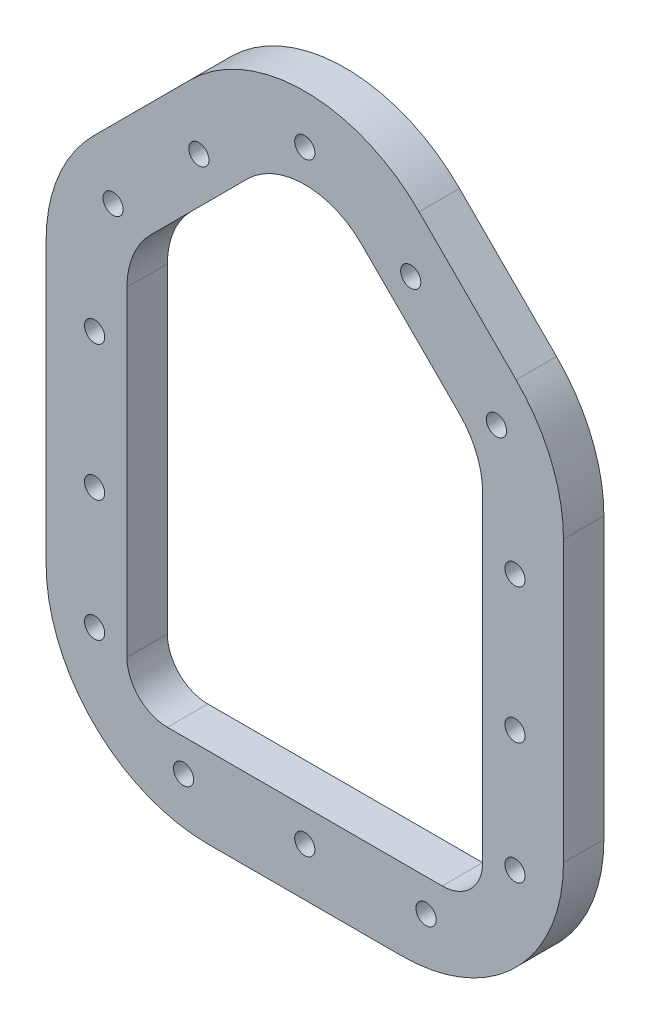
ISO-10303-21;
HEADER;
FILE_DESCRIPTION(('STEP AP214'),'2;1');
FILE_NAME('part.step','',(''),(''),'','','');
FILE_SCHEMA(('AUTOMOTIVE_DESIGN { 1 0 10303 214 1 1 1 1 }'));
ENDSEC;
DATA;
#1=APPLICATION_CONTEXT('core data for automotive mechanical design processes');
#2=APPLICATION_PROTOCOL_DEFINITION('international standard','automotive_design',2000,#1);
#3=PRODUCT_CONTEXT('',#1,'mechanical');
#4=PRODUCT('Part','Part','',(#3));
#5=PRODUCT_RELATED_PRODUCT_CATEGORY('part','',(#4));
#6=PRODUCT_DEFINITION_FORMATION('','',#4);
#7=PRODUCT_DEFINITION_CONTEXT('part definition',#1,'design');
#8=PRODUCT_DEFINITION('design','',#6,#7);
#9=PRODUCT_DEFINITION_SHAPE('','',#8);
#10=(LENGTH_UNIT() NAMED_UNIT(*) SI_UNIT(.MILLI.,.METRE.));
#11=(NAMED_UNIT(*) PLANE_ANGLE_UNIT() SI_UNIT($,.RADIAN.));
#12=(NAMED_UNIT(*) SI_UNIT($,.STERADIAN.) SOLID_ANGLE_UNIT());
#13=UNCERTAINTY_MEASURE_WITH_UNIT(LENGTH_MEASURE(1.E-05),#10,'distance_accuracy_value','');
#14=(GEOMETRIC_REPRESENTATION_CONTEXT(3) GLOBAL_UNCERTAINTY_ASSIGNED_CONTEXT((#13)) GLOBAL_UNIT_ASSIGNED_CONTEXT((#10,
#11,#12)) REPRESENTATION_CONTEXT('',''));
#15=CARTESIAN_POINT('',(0.,0.,0.));
#16=DIRECTION('',(0.,0.,1.));
#17=DIRECTION('',(1.,0.,0.));
#18=AXIS2_PLACEMENT_3D('',#15,#16,#17);
#19=CARTESIAN_POINT('',(-12.,59.6446609406726,5.));
#20=DIRECTION('',(0.,0.,1.));
#21=DIRECTION('',(1.,0.,0.));
#22=AXIS2_PLACEMENT_3D('',#19,#20,#21);
#23=PLANE('',#22);
#24=CARTESIAN_POINT('',(26.,21.1980390271856,5.));
#25=DIRECTION('',(0.,0.,1.));
#26=DIRECTION('',(-1.,0.,0.));
#27=AXIS2_PLACEMENT_3D('',#24,#25,#26);
#28=CIRCLE('',#27,1.25);
#29=CARTESIAN_POINT('',(24.75,21.1980390271856,5.));
#30=VERTEX_POINT('',#29);
#31=EDGE_CURVE('E594',#30,#30,#28,.T.);
#32=ORIENTED_EDGE('',*,*,#31,.F.);
#33=EDGE_LOOP('',(#32));
#34=FACE_BOUND('',#33,.T.);
#35=CARTESIAN_POINT('',(26.,52.9109961313419,5.));
#36=DIRECTION('',(0.,0.,1.));
#37=DIRECTION('',(-1.,0.,0.));
#38=AXIS2_PLACEMENT_3D('',#35,#36,#37);
#39=CIRCLE('',#38,1.25);
#40=CARTESIAN_POINT('',(24.75,52.9109961313419,5.));
#41=VERTEX_POINT('',#40);
#42=EDGE_CURVE('E614',#41,#41,#39,.T.);
#43=ORIENTED_EDGE('',*,*,#42,.F.);
#44=EDGE_LOOP('',(#43));
#45=FACE_BOUND('',#44,.T.);
#46=CARTESIAN_POINT('',(13.1020891710485,78.3415616428474,5.));
#47=DIRECTION('',(0.,0.,1.));
#48=DIRECTION('',(-1.,0.,0.));
#49=AXIS2_PLACEMENT_3D('',#46,#47,#48);
#50=CIRCLE('',#49,1.25000000000011);
#51=CARTESIAN_POINT('',(11.8520891710484,78.3415616428474,5.));
#52=VERTEX_POINT('',#51);
#53=EDGE_CURVE('E213',#52,#52,#50,.T.);
#54=ORIENTED_EDGE('',*,*,#53,.F.);
#55=EDGE_LOOP('',(#54));
#56=FACE_BOUND('',#55,.T.);
#57=CARTESIAN_POINT('',(0.,11.,5.));
#58=DIRECTION('',(0.,0.,1.));
#59=DIRECTION('',(1.,0.,0.));
#60=AXIS2_PLACEMENT_3D('',#57,#58,#59);
#61=CIRCLE('',#60,1.25);
#62=CARTESIAN_POINT('',(1.25000000000001,11.,5.));
#63=VERTEX_POINT('',#62);
#64=EDGE_CURVE('E246',#63,#63,#61,.T.);
#65=ORIENTED_EDGE('',*,*,#64,.F.);
#66=EDGE_LOOP('',(#65));
#67=FACE_BOUND('',#66,.T.);
#68=CARTESIAN_POINT('',(-26.,36.1980390271856,5.));
#69=DIRECTION('',(0.,0.,1.));
#70=DIRECTION('',(1.,0.,0.));
#71=AXIS2_PLACEMENT_3D('',#68,#69,#70);
#72=CIRCLE('',#71,1.25);
#73=CARTESIAN_POINT('',(-24.75,36.1980390271856,5.));
#74=VERTEX_POINT('',#73);
#75=EDGE_CURVE('E258',#74,#74,#72,.T.);
#76=ORIENTED_EDGE('',*,*,#75,.F.);
#77=EDGE_LOOP('',(#76));
#78=FACE_BOUND('',#77,.T.);
#79=CARTESIAN_POINT('',(-23.7086908888467,67.7349599250492,5.));
#80=DIRECTION('',(0.,0.,1.));
#81=DIRECTION('',(1.,0.,0.));
#82=AXIS2_PLACEMENT_3D('',#79,#80,#81);
#83=CIRCLE('',#82,1.25000000000013);
#84=CARTESIAN_POINT('',(-22.4586908888466,67.7349599250492,5.));
#85=VERTEX_POINT('',#84);
#86=EDGE_CURVE('E270',#85,#85,#83,.T.);
#87=ORIENTED_EDGE('',*,*,#86,.F.);
#88=EDGE_LOOP('',(#87));
#89=FACE_BOUND('',#88,.T.);
#90=CARTESIAN_POINT('',(0.,85.6446609406726,5.));
#91=DIRECTION('',(0.,0.,1.));
#92=DIRECTION('',(1.,0.,0.));
#93=AXIS2_PLACEMENT_3D('',#90,#91,#92);
#94=CIRCLE('',#93,1.25);
#95=CARTESIAN_POINT('',(1.25000000000001,85.6446609406726,5.));
#96=VERTEX_POINT('',#95);
#97=EDGE_CURVE('E282',#96,#96,#94,.T.);
#98=ORIENTED_EDGE('',*,*,#97,.F.);
#99=EDGE_LOOP('',(#98));
#100=FACE_BOUND('',#99,.T.);
#101=DIRECTION('',(0.,-1.,0.));
#102=VECTOR('',#101,1.);
#103=CARTESIAN_POINT('',(-32.,5.,5.));
#104=LINE('',#103,#102);
#105=CARTESIAN_POINT('',(-32.,59.6446609406726,5.));
#106=VERTEX_POINT('',#105);
#107=CARTESIAN_POINT('',(-32.,25.,5.));
#108=VERTEX_POINT('',#107);
#109=EDGE_CURVE('E288',#106,#108,#104,.T.);
#110=ORIENTED_EDGE('',*,*,#109,.T.);
#111=CARTESIAN_POINT('',(-12.,25.,5.));
#112=DIRECTION('',(0.,0.,1.));
#113=DIRECTION('',(1.,0.,0.));
#114=AXIS2_PLACEMENT_3D('',#111,#112,#113);
#115=CIRCLE('',#114,20.);
#116=CARTESIAN_POINT('',(-12.,5.,5.));
#117=VERTEX_POINT('',#116);
#118=EDGE_CURVE('E354',#108,#117,#115,.T.);
#119=ORIENTED_EDGE('',*,*,#118,.T.);
#120=DIRECTION('',(1.,0.,0.));
#121=VECTOR('',#120,1.);
#122=CARTESIAN_POINT('',(32.,5.,5.));
#123=LINE('',#122,#121);
#124=CARTESIAN_POINT('',(12.,5.,5.));
#125=VERTEX_POINT('',#124);
#126=EDGE_CURVE('E291',#117,#125,#123,.T.);
#127=ORIENTED_EDGE('',*,*,#126,.T.);
#128=CARTESIAN_POINT('',(12.,25.,5.));
#129=DIRECTION('',(0.,0.,1.));
#130=DIRECTION('',(1.,0.,0.));
#131=AXIS2_PLACEMENT_3D('',#128,#129,#130);
#132=CIRCLE('',#131,20.);
#133=CARTESIAN_POINT('',(32.,25.,5.));
#134=VERTEX_POINT('',#133);
#135=EDGE_CURVE('E352',#125,#134,#132,.T.);
#136=ORIENTED_EDGE('',*,*,#135,.T.);
#137=DIRECTION('',(0.,1.,0.));
#138=VECTOR('',#137,1.);
#139=CARTESIAN_POINT('',(32.,5.,5.));
#140=LINE('',#139,#138);
#141=CARTESIAN_POINT('',(32.,59.6446609406726,5.));
#142=VERTEX_POINT('',#141);
#143=EDGE_CURVE('E295',#134,#142,#140,.T.);
#144=ORIENTED_EDGE('',*,*,#143,.T.);
#145=CARTESIAN_POINT('',(12.,59.6446609406726,5.));
#146=DIRECTION('',(0.,0.,1.));
#147=DIRECTION('',(1.,0.,0.));
#148=AXIS2_PLACEMENT_3D('',#145,#146,#147);
#149=CIRCLE('',#148,20.);
#150=CARTESIAN_POINT('',(26.1421356237309,73.7867965644036,5.));
#151=VERTEX_POINT('',#150);
#152=EDGE_CURVE('E297',#142,#151,#149,.T.);
#153=ORIENTED_EDGE('',*,*,#152,.T.);
#154=DIRECTION('',(-0.707106781186549,0.707106781186546,0.));
#155=VECTOR('',#154,1.);
#156=CARTESIAN_POINT('',(26.1421356237309,73.7867965644036,5.));
#157=LINE('',#156,#155);
#158=CARTESIAN_POINT('',(14.142135623731,85.7867965644034,5.));
#159=VERTEX_POINT('',#158);
#160=EDGE_CURVE('E299',#151,#159,#157,.T.);
#161=ORIENTED_EDGE('',*,*,#160,.T.);
#162=CARTESIAN_POINT('',(0.,71.6446609406726,5.));
#163=DIRECTION('',(0.,0.,1.));
#164=DIRECTION('',(1.,0.,0.));
#165=AXIS2_PLACEMENT_3D('',#162,#163,#164);
#166=CIRCLE('',#165,20.);
#167=CARTESIAN_POINT('',(-14.1421356237309,85.7867965644035,5.));
#168=VERTEX_POINT('',#167);
#169=EDGE_CURVE('E301',#159,#168,#166,.T.);
#170=ORIENTED_EDGE('',*,*,#169,.T.);
#171=DIRECTION('',(-0.707106781186549,-0.707106781186546,0.));
#172=VECTOR('',#171,1.);
#173=CARTESIAN_POINT('',(-26.1421356237309,73.7867965644036,5.));
#174=LINE('',#173,#172);
#175=CARTESIAN_POINT('',(-26.1421356237309,73.7867965644036,5.));
#176=VERTEX_POINT('',#175);
#177=EDGE_CURVE('E303',#168,#176,#174,.T.);
#178=ORIENTED_EDGE('',*,*,#177,.T.);
#179=CARTESIAN_POINT('',(-12.,59.6446609406726,5.));
#180=DIRECTION('',(0.,0.,1.));
#181=DIRECTION('',(1.,0.,0.));
#182=AXIS2_PLACEMENT_3D('',#179,#180,#181);
#183=CIRCLE('',#182,20.);
#184=EDGE_CURVE('E305',#176,#106,#183,.T.);
#185=ORIENTED_EDGE('',*,*,#184,.T.);
#186=EDGE_LOOP('',(#110,#119,#127,#136,#144,#153,#161,#170,#178,#185));
#187=FACE_BOUND('',#186,.T.);
#188=CARTESIAN_POINT('',(-13.1020891710485,78.3415616428474,5.));
#189=DIRECTION('',(0.,0.,1.));
#190=DIRECTION('',(1.,0.,0.));
#191=AXIS2_PLACEMENT_3D('',#188,#189,#190);
#192=CIRCLE('',#191,1.25000000000011);
#193=CARTESIAN_POINT('',(-11.8520891710484,78.3415616428474,5.));
#194=VERTEX_POINT('',#193);
#195=EDGE_CURVE('E276',#194,#194,#192,.T.);
#196=ORIENTED_EDGE('',*,*,#195,.F.);
#197=EDGE_LOOP('',(#196));
#198=FACE_BOUND('',#197,.T.);
#199=CARTESIAN_POINT('',(-26.,52.9109961313419,5.));
#200=DIRECTION('',(0.,0.,1.));
#201=DIRECTION('',(1.,0.,0.));
#202=AXIS2_PLACEMENT_3D('',#199,#200,#201);
#203=CIRCLE('',#202,1.25000000000001);
#204=CARTESIAN_POINT('',(-24.75,52.9109961313419,5.));
#205=VERTEX_POINT('',#204);
#206=EDGE_CURVE('E264',#205,#205,#203,.T.);
#207=ORIENTED_EDGE('',*,*,#206,.F.);
#208=EDGE_LOOP('',(#207));
#209=FACE_BOUND('',#208,.T.);
#210=CARTESIAN_POINT('',(-26.,21.1980390271856,5.));
#211=DIRECTION('',(0.,0.,1.));
#212=DIRECTION('',(1.,0.,0.));
#213=AXIS2_PLACEMENT_3D('',#210,#211,#212);
#214=CIRCLE('',#213,1.25);
#215=CARTESIAN_POINT('',(-24.75,21.1980390271856,5.));
#216=VERTEX_POINT('',#215);
#217=EDGE_CURVE('E252',#216,#216,#214,.T.);
#218=ORIENTED_EDGE('',*,*,#217,.F.);
#219=EDGE_LOOP('',(#218));
#220=FACE_BOUND('',#219,.T.);
#221=CARTESIAN_POINT('',(-15.,11.,5.));
#222=DIRECTION('',(0.,0.,1.));
#223=DIRECTION('',(1.,0.,0.));
#224=AXIS2_PLACEMENT_3D('',#221,#222,#223);
#225=CIRCLE('',#224,1.25);
#226=CARTESIAN_POINT('',(-13.75,11.,5.));
#227=VERTEX_POINT('',#226);
#228=EDGE_CURVE('E240',#227,#227,#225,.T.);
#229=ORIENTED_EDGE('',*,*,#228,.F.);
#230=EDGE_LOOP('',(#229));
#231=FACE_BOUND('',#230,.T.);
#232=CARTESIAN_POINT('',(12.,59.6446609406726,5.));
#233=DIRECTION('',(0.,0.,1.));
#234=DIRECTION('',(1.,0.,0.));
#235=AXIS2_PLACEMENT_3D('',#232,#233,#234);
#236=CIRCLE('',#235,10.);
#237=CARTESIAN_POINT('',(22.,59.6446609406726,5.));
#238=VERTEX_POINT('',#237);
#239=CARTESIAN_POINT('',(19.0710678118655,66.7157287525381,5.));
#240=VERTEX_POINT('',#239);
#241=EDGE_CURVE('E179',#238,#240,#236,.T.);
#242=ORIENTED_EDGE('',*,*,#241,.F.);
#243=DIRECTION('',(0.,1.,0.));
#244=VECTOR('',#243,1.);
#245=CARTESIAN_POINT('',(22.,59.6446609406726,5.));
#246=LINE('',#245,#244);
#247=CARTESIAN_POINT('',(22.,20.,5.));
#248=VERTEX_POINT('',#247);
#249=EDGE_CURVE('E170',#248,#238,#246,.T.);
#250=ORIENTED_EDGE('',*,*,#249,.F.);
#251=CARTESIAN_POINT('',(17.,20.,5.));
#252=DIRECTION('',(0.,0.,1.));
#253=DIRECTION('',(1.,0.,0.));
#254=AXIS2_PLACEMENT_3D('',#251,#252,#253);
#255=CIRCLE('',#254,5.);
#256=CARTESIAN_POINT('',(17.,15.,5.));
#257=VERTEX_POINT('',#256);
#258=EDGE_CURVE('E369',#248,#257,#255,.F.);
#259=ORIENTED_EDGE('',*,*,#258,.T.);
#260=DIRECTION('',(1.,0.,0.));
#261=VECTOR('',#260,1.);
#262=CARTESIAN_POINT('',(-22.,15.,5.));
#263=LINE('',#262,#261);
#264=CARTESIAN_POINT('',(-17.,15.,5.));
#265=VERTEX_POINT('',#264);
#266=EDGE_CURVE('E207',#265,#257,#263,.T.);
#267=ORIENTED_EDGE('',*,*,#266,.F.);
#268=CARTESIAN_POINT('',(-17.,20.,5.));
#269=DIRECTION('',(0.,0.,1.));
#270=DIRECTION('',(1.,0.,0.));
#271=AXIS2_PLACEMENT_3D('',#268,#269,#270);
#272=CIRCLE('',#271,5.);
#273=CARTESIAN_POINT('',(-22.,20.,5.));
#274=VERTEX_POINT('',#273);
#275=EDGE_CURVE('E11',#265,#274,#272,.F.);
#276=ORIENTED_EDGE('',*,*,#275,.T.);
#277=DIRECTION('',(0.,-1.,0.));
#278=VECTOR('',#277,1.);
#279=CARTESIAN_POINT('',(-22.,59.6446609406726,5.));
#280=LINE('',#279,#278);
#281=CARTESIAN_POINT('',(-22.,59.6446609406726,5.));
#282=VERTEX_POINT('',#281);
#283=EDGE_CURVE('E205',#282,#274,#280,.T.);
#284=ORIENTED_EDGE('',*,*,#283,.F.);
#285=CARTESIAN_POINT('',(-12.,59.6446609406726,5.));
#286=DIRECTION('',(0.,0.,1.));
#287=DIRECTION('',(1.,0.,0.));
#288=AXIS2_PLACEMENT_3D('',#285,#286,#287);
#289=CIRCLE('',#288,9.99999999999999);
#290=CARTESIAN_POINT('',(-19.0710678118655,66.7157287525381,5.));
#291=VERTEX_POINT('',#290);
#292=EDGE_CURVE('E203',#291,#282,#289,.T.);
#293=ORIENTED_EDGE('',*,*,#292,.F.);
#294=DIRECTION('',(-0.707106781186548,-0.707106781186547,0.));
#295=VECTOR('',#294,1.);
#296=CARTESIAN_POINT('',(-19.0710678118655,66.7157287525381,5.));
#297=LINE('',#296,#295);
#298=CARTESIAN_POINT('',(-7.07106781186551,78.715728752538,5.));
#299=VERTEX_POINT('',#298);
#300=EDGE_CURVE('E201',#299,#291,#297,.T.);
#301=ORIENTED_EDGE('',*,*,#300,.F.);
#302=CARTESIAN_POINT('',(0.,71.6446609406726,5.));
#303=DIRECTION('',(0.,0.,1.));
#304=DIRECTION('',(1.,0.,0.));
#305=AXIS2_PLACEMENT_3D('',#302,#303,#304);
#306=CIRCLE('',#305,9.99999999999999);
#307=CARTESIAN_POINT('',(7.07106781186552,78.715728752538,5.));
#308=VERTEX_POINT('',#307);
#309=EDGE_CURVE('E196',#308,#299,#306,.T.);
#310=ORIENTED_EDGE('',*,*,#309,.F.);
#311=DIRECTION('',(-0.707106781186548,0.707106781186547,0.));
#312=VECTOR('',#311,1.);
#313=CARTESIAN_POINT('',(19.0710678118655,66.7157287525381,5.));
#314=LINE('',#313,#312);
#315=EDGE_CURVE('E194',#240,#308,#314,.T.);
#316=ORIENTED_EDGE('',*,*,#315,.F.);
#317=EDGE_LOOP('',(#242,#250,#259,#267,#276,#284,#293,#301,#310,#316));
#318=FACE_BOUND('',#317,.T.);
#319=CARTESIAN_POINT('',(23.7086908888467,67.7349599250492,5.));
#320=DIRECTION('',(0.,0.,1.));
#321=DIRECTION('',(-1.,0.,0.));
#322=AXIS2_PLACEMENT_3D('',#319,#320,#321);
#323=CIRCLE('',#322,1.25000000000013);
#324=CARTESIAN_POINT('',(22.4586908888466,67.7349599250492,5.));
#325=VERTEX_POINT('',#324);
#326=EDGE_CURVE('E620',#325,#325,#323,.T.);
#327=ORIENTED_EDGE('',*,*,#326,.F.);
#328=EDGE_LOOP('',(#327));
#329=FACE_BOUND('',#328,.T.);
#330=CARTESIAN_POINT('',(26.,36.1980390271856,5.));
#331=DIRECTION('',(0.,0.,1.));
#332=DIRECTION('',(-1.,0.,0.));
#333=AXIS2_PLACEMENT_3D('',#330,#331,#332);
#334=CIRCLE('',#333,1.25);
#335=CARTESIAN_POINT('',(24.75,36.1980390271856,5.));
#336=VERTEX_POINT('',#335);
#337=EDGE_CURVE('E608',#336,#336,#334,.T.);
#338=ORIENTED_EDGE('',*,*,#337,.F.);
#339=EDGE_LOOP('',(#338));
#340=FACE_BOUND('',#339,.T.);
#341=CARTESIAN_POINT('',(15.,11.,5.));
#342=DIRECTION('',(0.,0.,1.));
#343=DIRECTION('',(-1.,0.,0.));
#344=AXIS2_PLACEMENT_3D('',#341,#342,#343);
#345=CIRCLE('',#344,1.25);
#346=CARTESIAN_POINT('',(13.75,11.,5.));
#347=VERTEX_POINT('',#346);
#348=EDGE_CURVE('E599',#347,#347,#345,.T.);
#349=ORIENTED_EDGE('',*,*,#348,.F.);
#350=EDGE_LOOP('',(#349));
#351=FACE_BOUND('',#350,.T.);
#352=ADVANCED_FACE('F33',(#34,#45,#56,#67,#78,#89,#100,#187,#198,#209,#220,#231,#318,#329,#340,
#351),#23,.T.);
#353=CARTESIAN_POINT('',(-12.,59.6446609406726,0.));
#354=DIRECTION('',(0.,0.,1.));
#355=DIRECTION('',(1.,0.,0.));
#356=AXIS2_PLACEMENT_3D('',#353,#354,#355);
#357=PLANE('',#356);
#358=CARTESIAN_POINT('',(-15.,11.,0.));
#359=DIRECTION('',(0.,0.,1.));
#360=DIRECTION('',(1.,0.,0.));
#361=AXIS2_PLACEMENT_3D('',#358,#359,#360);
#362=CIRCLE('',#361,1.25);
#363=CARTESIAN_POINT('',(-13.75,11.,0.));
#364=VERTEX_POINT('',#363);
#365=EDGE_CURVE('E188',#364,#364,#362,.T.);
#366=ORIENTED_EDGE('',*,*,#365,.T.);
#367=EDGE_LOOP('',(#366));
#368=FACE_BOUND('',#367,.T.);
#369=CARTESIAN_POINT('',(0.,11.,0.));
#370=DIRECTION('',(0.,0.,1.));
#371=DIRECTION('',(1.,0.,0.));
#372=AXIS2_PLACEMENT_3D('',#369,#370,#371);
#373=CIRCLE('',#372,1.25);
#374=CARTESIAN_POINT('',(1.25000000000001,11.,0.));
#375=VERTEX_POINT('',#374);
#376=EDGE_CURVE('E243',#375,#375,#373,.T.);
#377=ORIENTED_EDGE('',*,*,#376,.T.);
#378=EDGE_LOOP('',(#377));
#379=FACE_BOUND('',#378,.T.);
#380=CARTESIAN_POINT('',(-26.,21.1980390271856,0.));
#381=DIRECTION('',(0.,0.,1.));
#382=DIRECTION('',(1.,0.,0.));
#383=AXIS2_PLACEMENT_3D('',#380,#381,#382);
#384=CIRCLE('',#383,1.25);
#385=CARTESIAN_POINT('',(-24.75,21.1980390271856,0.));
#386=VERTEX_POINT('',#385);
#387=EDGE_CURVE('E249',#386,#386,#384,.T.);
#388=ORIENTED_EDGE('',*,*,#387,.T.);
#389=EDGE_LOOP('',(#388));
#390=FACE_BOUND('',#389,.T.);
#391=CARTESIAN_POINT('',(-26.,36.1980390271856,0.));
#392=DIRECTION('',(0.,0.,1.));
#393=DIRECTION('',(1.,0.,0.));
#394=AXIS2_PLACEMENT_3D('',#391,#392,#393);
#395=CIRCLE('',#394,1.25);
#396=CARTESIAN_POINT('',(-24.75,36.1980390271856,0.));
#397=VERTEX_POINT('',#396);
#398=EDGE_CURVE('E255',#397,#397,#395,.T.);
#399=ORIENTED_EDGE('',*,*,#398,.T.);
#400=EDGE_LOOP('',(#399));
#401=FACE_BOUND('',#400,.T.);
#402=CARTESIAN_POINT('',(-26.,52.9109961313419,0.));
#403=DIRECTION('',(0.,0.,1.));
#404=DIRECTION('',(1.,0.,0.));
#405=AXIS2_PLACEMENT_3D('',#402,#403,#404);
#406=CIRCLE('',#405,1.25000000000001);
#407=CARTESIAN_POINT('',(-24.75,52.9109961313419,0.));
#408=VERTEX_POINT('',#407);
#409=EDGE_CURVE('E261',#408,#408,#406,.T.);
#410=ORIENTED_EDGE('',*,*,#409,.T.);
#411=EDGE_LOOP('',(#410));
#412=FACE_BOUND('',#411,.T.);
#413=CARTESIAN_POINT('',(-23.7086908888467,67.7349599250492,0.));
#414=DIRECTION('',(0.,0.,1.));
#415=DIRECTION('',(1.,0.,0.));
#416=AXIS2_PLACEMENT_3D('',#413,#414,#415);
#417=CIRCLE('',#416,1.25000000000013);
#418=CARTESIAN_POINT('',(-22.4586908888466,67.7349599250492,0.));
#419=VERTEX_POINT('',#418);
#420=EDGE_CURVE('E267',#419,#419,#417,.T.);
#421=ORIENTED_EDGE('',*,*,#420,.T.);
#422=EDGE_LOOP('',(#421));
#423=FACE_BOUND('',#422,.T.);
#424=CARTESIAN_POINT('',(-13.1020891710485,78.3415616428474,0.));
#425=DIRECTION('',(0.,0.,1.));
#426=DIRECTION('',(1.,0.,0.));
#427=AXIS2_PLACEMENT_3D('',#424,#425,#426);
#428=CIRCLE('',#427,1.25000000000011);
#429=CARTESIAN_POINT('',(-11.8520891710484,78.3415616428474,0.));
#430=VERTEX_POINT('',#429);
#431=EDGE_CURVE('E273',#430,#430,#428,.T.);
#432=ORIENTED_EDGE('',*,*,#431,.T.);
#433=EDGE_LOOP('',(#432));
#434=FACE_BOUND('',#433,.T.);
#435=CARTESIAN_POINT('',(0.,85.6446609406726,0.));
#436=DIRECTION('',(0.,0.,1.));
#437=DIRECTION('',(1.,0.,0.));
#438=AXIS2_PLACEMENT_3D('',#435,#436,#437);
#439=CIRCLE('',#438,1.25);
#440=CARTESIAN_POINT('',(1.25000000000001,85.6446609406726,0.));
#441=VERTEX_POINT('',#440);
#442=EDGE_CURVE('E279',#441,#441,#439,.T.);
#443=ORIENTED_EDGE('',*,*,#442,.T.);
#444=EDGE_LOOP('',(#443));
#445=FACE_BOUND('',#444,.T.);
#446=DIRECTION('',(1.,0.,0.));
#447=VECTOR('',#446,1.);
#448=CARTESIAN_POINT('',(32.,5.,0.));
#449=LINE('',#448,#447);
#450=CARTESIAN_POINT('',(-12.,5.,0.));
#451=VERTEX_POINT('',#450);
#452=CARTESIAN_POINT('',(12.,5.,0.));
#453=VERTEX_POINT('',#452);
#454=EDGE_CURVE('E310',#451,#453,#449,.T.);
#455=ORIENTED_EDGE('',*,*,#454,.F.);
#456=CARTESIAN_POINT('',(-12.,25.,0.));
#457=DIRECTION('',(0.,0.,1.));
#458=DIRECTION('',(1.,0.,0.));
#459=AXIS2_PLACEMENT_3D('',#456,#457,#458);
#460=CIRCLE('',#459,20.);
#461=CARTESIAN_POINT('',(-32.,25.,0.));
#462=VERTEX_POINT('',#461);
#463=EDGE_CURVE('E348',#451,#462,#460,.F.);
#464=ORIENTED_EDGE('',*,*,#463,.T.);
#465=DIRECTION('',(0.,-1.,0.));
#466=VECTOR('',#465,1.);
#467=CARTESIAN_POINT('',(-32.,5.,0.));
#468=LINE('',#467,#466);
#469=CARTESIAN_POINT('',(-32.,59.6446609406726,0.));
#470=VERTEX_POINT('',#469);
#471=EDGE_CURVE('E285',#470,#462,#468,.T.);
#472=ORIENTED_EDGE('',*,*,#471,.F.);
#473=CARTESIAN_POINT('',(-12.,59.6446609406726,0.));
#474=DIRECTION('',(0.,0.,1.));
#475=DIRECTION('',(1.,0.,0.));
#476=AXIS2_PLACEMENT_3D('',#473,#474,#475);
#477=CIRCLE('',#476,20.);
#478=CARTESIAN_POINT('',(-26.1421356237309,73.7867965644036,0.));
#479=VERTEX_POINT('',#478);
#480=EDGE_CURVE('E292',#479,#470,#477,.T.);
#481=ORIENTED_EDGE('',*,*,#480,.F.);
#482=DIRECTION('',(-0.707106781186549,-0.707106781186546,0.));
#483=VECTOR('',#482,1.);
#484=CARTESIAN_POINT('',(-26.1421356237309,73.7867965644036,0.));
#485=LINE('',#484,#483);
#486=CARTESIAN_POINT('',(-14.1421356237309,85.7867965644035,0.));
#487=VERTEX_POINT('',#486);
#488=EDGE_CURVE('E321',#487,#479,#485,.T.);
#489=ORIENTED_EDGE('',*,*,#488,.F.);
#490=CARTESIAN_POINT('',(0.,71.6446609406726,0.));
#491=DIRECTION('',(0.,0.,1.));
#492=DIRECTION('',(1.,0.,0.));
#493=AXIS2_PLACEMENT_3D('',#490,#491,#492);
#494=CIRCLE('',#493,20.);
#495=CARTESIAN_POINT('',(14.142135623731,85.7867965644034,0.));
#496=VERTEX_POINT('',#495);
#497=EDGE_CURVE('E319',#496,#487,#494,.T.);
#498=ORIENTED_EDGE('',*,*,#497,.F.);
#499=DIRECTION('',(-0.707106781186549,0.707106781186546,0.));
#500=VECTOR('',#499,1.);
#501=CARTESIAN_POINT('',(26.1421356237309,73.7867965644036,0.));
#502=LINE('',#501,#500);
#503=CARTESIAN_POINT('',(26.1421356237309,73.7867965644036,0.));
#504=VERTEX_POINT('',#503);
#505=EDGE_CURVE('E317',#504,#496,#502,.T.);
#506=ORIENTED_EDGE('',*,*,#505,.F.);
#507=CARTESIAN_POINT('',(12.,59.6446609406726,0.));
#508=DIRECTION('',(0.,0.,1.));
#509=DIRECTION('',(1.,0.,0.));
#510=AXIS2_PLACEMENT_3D('',#507,#508,#509);
#511=CIRCLE('',#510,20.);
#512=CARTESIAN_POINT('',(32.,59.6446609406726,0.));
#513=VERTEX_POINT('',#512);
#514=EDGE_CURVE('E315',#513,#504,#511,.T.);
#515=ORIENTED_EDGE('',*,*,#514,.F.);
#516=DIRECTION('',(0.,1.,0.));
#517=VECTOR('',#516,1.);
#518=CARTESIAN_POINT('',(32.,5.,0.));
#519=LINE('',#518,#517);
#520=CARTESIAN_POINT('',(32.,25.,0.));
#521=VERTEX_POINT('',#520);
#522=EDGE_CURVE('E313',#521,#513,#519,.T.);
#523=ORIENTED_EDGE('',*,*,#522,.F.);
#524=CARTESIAN_POINT('',(12.,25.,0.));
#525=DIRECTION('',(0.,0.,1.));
#526=DIRECTION('',(1.,0.,0.));
#527=AXIS2_PLACEMENT_3D('',#524,#525,#526);
#528=CIRCLE('',#527,20.);
#529=EDGE_CURVE('E346',#521,#453,#528,.F.);
#530=ORIENTED_EDGE('',*,*,#529,.T.);
#531=EDGE_LOOP('',(#455,#464,#472,#481,#489,#498,#506,#515,#523,#530));
#532=FACE_BOUND('',#531,.T.);
#533=DIRECTION('',(1.,0.,0.));
#534=VECTOR('',#533,1.);
#535=CARTESIAN_POINT('',(-22.,15.,0.));
#536=LINE('',#535,#534);
#537=CARTESIAN_POINT('',(-17.,15.,0.));
#538=VERTEX_POINT('',#537);
#539=CARTESIAN_POINT('',(17.,15.,0.));
#540=VERTEX_POINT('',#539);
#541=EDGE_CURVE('E180',#538,#540,#536,.T.);
#542=ORIENTED_EDGE('',*,*,#541,.T.);
#543=CARTESIAN_POINT('',(17.,20.,0.));
#544=DIRECTION('',(0.,0.,1.));
#545=DIRECTION('',(1.,0.,0.));
#546=AXIS2_PLACEMENT_3D('',#543,#544,#545);
#547=CIRCLE('',#546,5.);
#548=CARTESIAN_POINT('',(22.,20.,0.));
#549=VERTEX_POINT('',#548);
#550=EDGE_CURVE('E367',#540,#549,#547,.T.);
#551=ORIENTED_EDGE('',*,*,#550,.T.);
#552=DIRECTION('',(0.,1.,0.));
#553=VECTOR('',#552,1.);
#554=CARTESIAN_POINT('',(22.,59.6446609406726,0.));
#555=LINE('',#554,#553);
#556=CARTESIAN_POINT('',(22.,59.6446609406726,0.));
#557=VERTEX_POINT('',#556);
#558=EDGE_CURVE('E211',#549,#557,#555,.T.);
#559=ORIENTED_EDGE('',*,*,#558,.T.);
#560=CARTESIAN_POINT('',(12.,59.6446609406726,0.));
#561=DIRECTION('',(0.,0.,1.));
#562=DIRECTION('',(1.,0.,0.));
#563=AXIS2_PLACEMENT_3D('',#560,#561,#562);
#564=CIRCLE('',#563,10.);
#565=CARTESIAN_POINT('',(19.0710678118655,66.7157287525381,0.));
#566=VERTEX_POINT('',#565);
#567=EDGE_CURVE('E187',#557,#566,#564,.T.);
#568=ORIENTED_EDGE('',*,*,#567,.T.);
#569=DIRECTION('',(-0.707106781186548,0.707106781186547,0.));
#570=VECTOR('',#569,1.);
#571=CARTESIAN_POINT('',(19.0710678118655,66.7157287525381,0.));
#572=LINE('',#571,#570);
#573=CARTESIAN_POINT('',(7.07106781186552,78.715728752538,0.));
#574=VERTEX_POINT('',#573);
#575=EDGE_CURVE('E215',#566,#574,#572,.T.);
#576=ORIENTED_EDGE('',*,*,#575,.T.);
#577=CARTESIAN_POINT('',(0.,71.6446609406726,0.));
#578=DIRECTION('',(0.,0.,1.));
#579=DIRECTION('',(1.,0.,0.));
#580=AXIS2_PLACEMENT_3D('',#577,#578,#579);
#581=CIRCLE('',#580,9.99999999999999);
#582=CARTESIAN_POINT('',(-7.07106781186551,78.715728752538,0.));
#583=VERTEX_POINT('',#582);
#584=EDGE_CURVE('E218',#574,#583,#581,.T.);
#585=ORIENTED_EDGE('',*,*,#584,.T.);
#586=DIRECTION('',(-0.707106781186548,-0.707106781186547,0.));
#587=VECTOR('',#586,1.);
#588=CARTESIAN_POINT('',(-19.0710678118655,66.7157287525381,0.));
#589=LINE('',#588,#587);
#590=CARTESIAN_POINT('',(-19.0710678118655,66.7157287525381,0.));
#591=VERTEX_POINT('',#590);
#592=EDGE_CURVE('E221',#583,#591,#589,.T.);
#593=ORIENTED_EDGE('',*,*,#592,.T.);
#594=CARTESIAN_POINT('',(-12.,59.6446609406726,0.));
#595=DIRECTION('',(0.,0.,1.));
#596=DIRECTION('',(1.,0.,0.));
#597=AXIS2_PLACEMENT_3D('',#594,#595,#596);
#598=CIRCLE('',#597,9.99999999999999);
#599=CARTESIAN_POINT('',(-22.,59.6446609406726,0.));
#600=VERTEX_POINT('',#599);
#601=EDGE_CURVE('E224',#591,#600,#598,.T.);
#602=ORIENTED_EDGE('',*,*,#601,.T.);
#603=DIRECTION('',(0.,-1.,0.));
#604=VECTOR('',#603,1.);
#605=CARTESIAN_POINT('',(-22.,59.6446609406726,0.));
#606=LINE('',#605,#604);
#607=CARTESIAN_POINT('',(-22.,20.,0.));
#608=VERTEX_POINT('',#607);
#609=EDGE_CURVE('E227',#600,#608,#606,.T.);
#610=ORIENTED_EDGE('',*,*,#609,.T.);
#611=CARTESIAN_POINT('',(-17.,20.,0.));
#612=DIRECTION('',(0.,0.,1.));
#613=DIRECTION('',(1.,0.,0.));
#614=AXIS2_PLACEMENT_3D('',#611,#612,#613);
#615=CIRCLE('',#614,5.);
#616=EDGE_CURVE('E41',#608,#538,#615,.T.);
#617=ORIENTED_EDGE('',*,*,#616,.T.);
#618=EDGE_LOOP('',(#542,#551,#559,#568,#576,#585,#593,#602,#610,#617));
#619=FACE_BOUND('',#618,.T.);
#620=CARTESIAN_POINT('',(13.1020891710485,78.3415616428474,0.));
#621=DIRECTION('',(0.,0.,1.));
#622=DIRECTION('',(-1.,0.,0.));
#623=AXIS2_PLACEMENT_3D('',#620,#621,#622);
#624=CIRCLE('',#623,1.25000000000011);
#625=CARTESIAN_POINT('',(11.8520891710484,78.3415616428474,0.));
#626=VERTEX_POINT('',#625);
#627=EDGE_CURVE('E623',#626,#626,#624,.T.);
#628=ORIENTED_EDGE('',*,*,#627,.T.);
#629=EDGE_LOOP('',(#628));
#630=FACE_BOUND('',#629,.T.);
#631=CARTESIAN_POINT('',(23.7086908888467,67.7349599250492,0.));
#632=DIRECTION('',(0.,0.,1.));
#633=DIRECTION('',(-1.,0.,0.));
#634=AXIS2_PLACEMENT_3D('',#631,#632,#633);
#635=CIRCLE('',#634,1.25000000000013);
#636=CARTESIAN_POINT('',(22.4586908888466,67.7349599250492,0.));
#637=VERTEX_POINT('',#636);
#638=EDGE_CURVE('E617',#637,#637,#635,.T.);
#639=ORIENTED_EDGE('',*,*,#638,.T.);
#640=EDGE_LOOP('',(#639));
#641=FACE_BOUND('',#640,.T.);
#642=CARTESIAN_POINT('',(26.,52.9109961313419,0.));
#643=DIRECTION('',(0.,0.,1.));
#644=DIRECTION('',(-1.,0.,0.));
#645=AXIS2_PLACEMENT_3D('',#642,#643,#644);
#646=CIRCLE('',#645,1.25);
#647=CARTESIAN_POINT('',(24.75,52.9109961313419,0.));
#648=VERTEX_POINT('',#647);
#649=EDGE_CURVE('E611',#648,#648,#646,.T.);
#650=ORIENTED_EDGE('',*,*,#649,.T.);
#651=EDGE_LOOP('',(#650));
#652=FACE_BOUND('',#651,.T.);
#653=CARTESIAN_POINT('',(26.,36.1980390271856,0.));
#654=DIRECTION('',(0.,0.,1.));
#655=DIRECTION('',(-1.,0.,0.));
#656=AXIS2_PLACEMENT_3D('',#653,#654,#655);
#657=CIRCLE('',#656,1.25);
#658=CARTESIAN_POINT('',(24.75,36.1980390271856,0.));
#659=VERTEX_POINT('',#658);
#660=EDGE_CURVE('E601',#659,#659,#657,.T.);
#661=ORIENTED_EDGE('',*,*,#660,.T.);
#662=EDGE_LOOP('',(#661));
#663=FACE_BOUND('',#662,.T.);
#664=CARTESIAN_POINT('',(26.,21.1980390271856,0.));
#665=DIRECTION('',(0.,0.,1.));
#666=DIRECTION('',(-1.,0.,0.));
#667=AXIS2_PLACEMENT_3D('',#664,#665,#666);
#668=CIRCLE('',#667,1.25);
#669=CARTESIAN_POINT('',(24.75,21.1980390271856,0.));
#670=VERTEX_POINT('',#669);
#671=EDGE_CURVE('E597',#670,#670,#668,.T.);
#672=ORIENTED_EDGE('',*,*,#671,.T.);
#673=EDGE_LOOP('',(#672));
#674=FACE_BOUND('',#673,.T.);
#675=CARTESIAN_POINT('',(15.,11.,0.));
#676=DIRECTION('',(0.,0.,1.));
#677=DIRECTION('',(-1.,0.,0.));
#678=AXIS2_PLACEMENT_3D('',#675,#676,#677);
#679=CIRCLE('',#678,1.25);
#680=CARTESIAN_POINT('',(13.75,11.,0.));
#681=VERTEX_POINT('',#680);
#682=EDGE_CURVE('E604',#681,#681,#679,.T.);
#683=ORIENTED_EDGE('',*,*,#682,.T.);
#684=EDGE_LOOP('',(#683));
#685=FACE_BOUND('',#684,.T.);
#686=ADVANCED_FACE('F372',(#368,#379,#390,#401,#412,#423,#434,#445,#532,#619,#630,#641,#652,
#663,#674,#685),#357,.F.);
#687=CARTESIAN_POINT('',(-32.,5.,5.));
#688=DIRECTION('',(1.,0.,0.));
#689=DIRECTION('',(0.,0.,-1.));
#690=AXIS2_PLACEMENT_3D('',#687,#688,#689);
#691=PLANE('',#690);
#692=ORIENTED_EDGE('',*,*,#471,.T.);
#693=DIRECTION('',(0.,0.,-1.));
#694=VECTOR('',#693,1.);
#695=CARTESIAN_POINT('',(-32.,25.,5.));
#696=LINE('',#695,#694);
#697=EDGE_CURVE('E350',#462,#108,#696,.F.);
#698=ORIENTED_EDGE('',*,*,#697,.T.);
#699=ORIENTED_EDGE('',*,*,#109,.F.);
#700=DIRECTION('',(0.,0.,-1.));
#701=VECTOR('',#700,1.);
#702=CARTESIAN_POINT('',(-32.,59.6446609406726,5.));
#703=LINE('',#702,#701);
#704=EDGE_CURVE('E307',#106,#470,#703,.T.);
#705=ORIENTED_EDGE('',*,*,#704,.T.);
#706=EDGE_LOOP('',(#692,#698,#699,#705));
#707=FACE_BOUND('',#706,.T.);
#708=ADVANCED_FACE('F415',(#707),#691,.F.);
#709=CARTESIAN_POINT('',(32.,5.,5.));
#710=DIRECTION('',(0.,1.,0.));
#711=DIRECTION('',(0.,0.,1.));
#712=AXIS2_PLACEMENT_3D('',#709,#710,#711);
#713=PLANE('',#712);
#714=ORIENTED_EDGE('',*,*,#126,.F.);
#715=DIRECTION('',(0.,0.,-1.));
#716=VECTOR('',#715,1.);
#717=CARTESIAN_POINT('',(-12.,5.,5.));
#718=LINE('',#717,#716);
#719=EDGE_CURVE('E343',#117,#451,#718,.T.);
#720=ORIENTED_EDGE('',*,*,#719,.T.);
#721=ORIENTED_EDGE('',*,*,#454,.T.);
#722=DIRECTION('',(0.,0.,-1.));
#723=VECTOR('',#722,1.);
#724=CARTESIAN_POINT('',(12.,5.,5.));
#725=LINE('',#724,#723);
#726=EDGE_CURVE('E341',#453,#125,#725,.F.);
#727=ORIENTED_EDGE('',*,*,#726,.T.);
#728=EDGE_LOOP('',(#714,#720,#721,#727));
#729=FACE_BOUND('',#728,.T.);
#730=ADVANCED_FACE('F447',(#729),#713,.F.);
#731=CARTESIAN_POINT('',(32.,5.,5.));
#732=DIRECTION('',(-1.,0.,0.));
#733=DIRECTION('',(0.,-1.,0.));
#734=AXIS2_PLACEMENT_3D('',#731,#732,#733);
#735=PLANE('',#734);
#736=ORIENTED_EDGE('',*,*,#143,.F.);
#737=DIRECTION('',(0.,0.,-1.));
#738=VECTOR('',#737,1.);
#739=CARTESIAN_POINT('',(32.,25.,5.));
#740=LINE('',#739,#738);
#741=EDGE_CURVE('E356',#134,#521,#740,.T.);
#742=ORIENTED_EDGE('',*,*,#741,.T.);
#743=ORIENTED_EDGE('',*,*,#522,.T.);
#744=DIRECTION('',(0.,0.,-1.));
#745=VECTOR('',#744,1.);
#746=CARTESIAN_POINT('',(32.,59.6446609406726,5.));
#747=LINE('',#746,#745);
#748=EDGE_CURVE('E338',#142,#513,#747,.T.);
#749=ORIENTED_EDGE('',*,*,#748,.F.);
#750=EDGE_LOOP('',(#736,#742,#743,#749));
#751=FACE_BOUND('',#750,.T.);
#752=ADVANCED_FACE('F443',(#751),#735,.F.);
#753=CARTESIAN_POINT('',(12.,59.6446609406726,5.));
#754=DIRECTION('',(0.,0.,-1.));
#755=DIRECTION('',(-1.,0.,0.));
#756=AXIS2_PLACEMENT_3D('',#753,#754,#755);
#757=CYLINDRICAL_SURFACE('',#756,20.);
#758=ORIENTED_EDGE('',*,*,#514,.T.);
#759=DIRECTION('',(0.,0.,-1.));
#760=VECTOR('',#759,1.);
#761=CARTESIAN_POINT('',(26.1421356237309,73.7867965644036,5.));
#762=LINE('',#761,#760);
#763=EDGE_CURVE('E335',#151,#504,#762,.T.);
#764=ORIENTED_EDGE('',*,*,#763,.F.);
#765=ORIENTED_EDGE('',*,*,#152,.F.);
#766=ORIENTED_EDGE('',*,*,#748,.T.);
#767=EDGE_LOOP('',(#758,#764,#765,#766));
#768=FACE_BOUND('',#767,.T.);
#769=ADVANCED_FACE('F439',(#768),#757,.T.);
#770=CARTESIAN_POINT('',(26.1421356237309,73.7867965644036,5.));
#771=DIRECTION('',(-0.707106781186546,-0.707106781186549,0.));
#772=DIRECTION('',(0.707106781186549,-0.707106781186546,0.));
#773=AXIS2_PLACEMENT_3D('',#770,#771,#772);
#774=PLANE('',#773);
#775=ORIENTED_EDGE('',*,*,#505,.T.);
#776=DIRECTION('',(0.,0.,-1.));
#777=VECTOR('',#776,1.);
#778=CARTESIAN_POINT('',(14.142135623731,85.7867965644034,5.));
#779=LINE('',#778,#777);
#780=EDGE_CURVE('E332',#159,#496,#779,.T.);
#781=ORIENTED_EDGE('',*,*,#780,.F.);
#782=ORIENTED_EDGE('',*,*,#160,.F.);
#783=ORIENTED_EDGE('',*,*,#763,.T.);
#784=EDGE_LOOP('',(#775,#781,#782,#783));
#785=FACE_BOUND('',#784,.T.);
#786=ADVANCED_FACE('F435',(#785),#774,.F.);
#787=CARTESIAN_POINT('',(0.,71.6446609406726,5.));
#788=DIRECTION('',(0.,0.,-1.));
#789=DIRECTION('',(-1.,0.,0.));
#790=AXIS2_PLACEMENT_3D('',#787,#788,#789);
#791=CYLINDRICAL_SURFACE('',#790,20.);
#792=ORIENTED_EDGE('',*,*,#497,.T.);
#793=DIRECTION('',(0.,0.,-1.));
#794=VECTOR('',#793,1.);
#795=CARTESIAN_POINT('',(-14.1421356237309,85.7867965644035,5.));
#796=LINE('',#795,#794);
#797=EDGE_CURVE('E329',#168,#487,#796,.T.);
#798=ORIENTED_EDGE('',*,*,#797,.F.);
#799=ORIENTED_EDGE('',*,*,#169,.F.);
#800=ORIENTED_EDGE('',*,*,#780,.T.);
#801=EDGE_LOOP('',(#792,#798,#799,#800));
#802=FACE_BOUND('',#801,.T.);
#803=ADVANCED_FACE('F431',(#802),#791,.T.);
#804=CARTESIAN_POINT('',(-26.1421356237309,73.7867965644036,5.));
#805=DIRECTION('',(0.707106781186546,-0.707106781186549,0.));
#806=DIRECTION('',(0.707106781186549,0.707106781186546,0.));
#807=AXIS2_PLACEMENT_3D('',#804,#805,#806);
#808=PLANE('',#807);
#809=ORIENTED_EDGE('',*,*,#488,.T.);
#810=DIRECTION('',(0.,0.,-1.));
#811=VECTOR('',#810,1.);
#812=CARTESIAN_POINT('',(-26.1421356237309,73.7867965644036,5.));
#813=LINE('',#812,#811);
#814=EDGE_CURVE('E326',#176,#479,#813,.T.);
#815=ORIENTED_EDGE('',*,*,#814,.F.);
#816=ORIENTED_EDGE('',*,*,#177,.F.);
#817=ORIENTED_EDGE('',*,*,#797,.T.);
#818=EDGE_LOOP('',(#809,#815,#816,#817));
#819=FACE_BOUND('',#818,.T.);
#820=ADVANCED_FACE('F427',(#819),#808,.F.);
#821=CARTESIAN_POINT('',(-12.,59.6446609406726,5.));
#822=DIRECTION('',(0.,0.,-1.));
#823=DIRECTION('',(-1.,0.,0.));
#824=AXIS2_PLACEMENT_3D('',#821,#822,#823);
#825=CYLINDRICAL_SURFACE('',#824,20.);
#826=ORIENTED_EDGE('',*,*,#480,.T.);
#827=ORIENTED_EDGE('',*,*,#704,.F.);
#828=ORIENTED_EDGE('',*,*,#184,.F.);
#829=ORIENTED_EDGE('',*,*,#814,.T.);
#830=EDGE_LOOP('',(#826,#827,#828,#829));
#831=FACE_BOUND('',#830,.T.);
#832=ADVANCED_FACE('F424',(#831),#825,.T.);
#833=CARTESIAN_POINT('',(0.,85.6446609406726,5.));
#834=DIRECTION('',(0.,0.,-1.));
#835=DIRECTION('',(-1.,0.,0.));
#836=AXIS2_PLACEMENT_3D('',#833,#834,#835);
#837=CYLINDRICAL_SURFACE('',#836,1.25);
#838=ORIENTED_EDGE('',*,*,#97,.T.);
#839=EDGE_LOOP('',(#838));
#840=FACE_BOUND('',#839,.T.);
#841=ORIENTED_EDGE('',*,*,#442,.F.);
#842=EDGE_LOOP('',(#841));
#843=FACE_BOUND('',#842,.T.);
#844=ADVANCED_FACE('F421',(#840,#843),#837,.F.);
#845=CARTESIAN_POINT('',(-13.1020891710485,78.3415616428474,5.));
#846=DIRECTION('',(0.,0.,-1.));
#847=DIRECTION('',(-1.,0.,0.));
#848=AXIS2_PLACEMENT_3D('',#845,#846,#847);
#849=CYLINDRICAL_SURFACE('',#848,1.25000000000011);
#850=ORIENTED_EDGE('',*,*,#195,.T.);
#851=EDGE_LOOP('',(#850));
#852=FACE_BOUND('',#851,.T.);
#853=ORIENTED_EDGE('',*,*,#431,.F.);
#854=EDGE_LOOP('',(#853));
#855=FACE_BOUND('',#854,.T.);
#856=ADVANCED_FACE('F525',(#852,#855),#849,.F.);
#857=CARTESIAN_POINT('',(-23.7086908888467,67.7349599250492,5.));
#858=DIRECTION('',(0.,0.,-1.));
#859=DIRECTION('',(-1.,0.,0.));
#860=AXIS2_PLACEMENT_3D('',#857,#858,#859);
#861=CYLINDRICAL_SURFACE('',#860,1.25000000000013);
#862=ORIENTED_EDGE('',*,*,#86,.T.);
#863=EDGE_LOOP('',(#862));
#864=FACE_BOUND('',#863,.T.);
#865=ORIENTED_EDGE('',*,*,#420,.F.);
#866=EDGE_LOOP('',(#865));
#867=FACE_BOUND('',#866,.T.);
#868=ADVANCED_FACE('F530',(#864,#867),#861,.F.);
#869=CARTESIAN_POINT('',(-26.,52.9109961313419,5.));
#870=DIRECTION('',(0.,0.,-1.));
#871=DIRECTION('',(-1.,0.,0.));
#872=AXIS2_PLACEMENT_3D('',#869,#870,#871);
#873=CYLINDRICAL_SURFACE('',#872,1.25000000000001);
#874=ORIENTED_EDGE('',*,*,#206,.T.);
#875=EDGE_LOOP('',(#874));
#876=FACE_BOUND('',#875,.T.);
#877=ORIENTED_EDGE('',*,*,#409,.F.);
#878=EDGE_LOOP('',(#877));
#879=FACE_BOUND('',#878,.T.);
#880=ADVANCED_FACE('F537',(#876,#879),#873,.F.);
#881=CARTESIAN_POINT('',(-26.,36.1980390271856,5.));
#882=DIRECTION('',(0.,0.,-1.));
#883=DIRECTION('',(-1.,0.,0.));
#884=AXIS2_PLACEMENT_3D('',#881,#882,#883);
#885=CYLINDRICAL_SURFACE('',#884,1.25);
#886=ORIENTED_EDGE('',*,*,#75,.T.);
#887=EDGE_LOOP('',(#886));
#888=FACE_BOUND('',#887,.T.);
#889=ORIENTED_EDGE('',*,*,#398,.F.);
#890=EDGE_LOOP('',(#889));
#891=FACE_BOUND('',#890,.T.);
#892=ADVANCED_FACE('F544',(#888,#891),#885,.F.);
#893=CARTESIAN_POINT('',(-26.,21.1980390271856,5.));
#894=DIRECTION('',(0.,0.,-1.));
#895=DIRECTION('',(-1.,0.,0.));
#896=AXIS2_PLACEMENT_3D('',#893,#894,#895);
#897=CYLINDRICAL_SURFACE('',#896,1.25);
#898=ORIENTED_EDGE('',*,*,#217,.T.);
#899=EDGE_LOOP('',(#898));
#900=FACE_BOUND('',#899,.T.);
#901=ORIENTED_EDGE('',*,*,#387,.F.);
#902=EDGE_LOOP('',(#901));
#903=FACE_BOUND('',#902,.T.);
#904=ADVANCED_FACE('F548',(#900,#903),#897,.F.);
#905=CARTESIAN_POINT('',(0.,11.,5.));
#906=DIRECTION('',(0.,0.,-1.));
#907=DIRECTION('',(-1.,0.,0.));
#908=AXIS2_PLACEMENT_3D('',#905,#906,#907);
#909=CYLINDRICAL_SURFACE('',#908,1.25);
#910=ORIENTED_EDGE('',*,*,#64,.T.);
#911=EDGE_LOOP('',(#910));
#912=FACE_BOUND('',#911,.T.);
#913=ORIENTED_EDGE('',*,*,#376,.F.);
#914=EDGE_LOOP('',(#913));
#915=FACE_BOUND('',#914,.T.);
#916=ADVANCED_FACE('F506',(#912,#915),#909,.F.);
#917=CARTESIAN_POINT('',(-15.,11.,5.));
#918=DIRECTION('',(0.,0.,-1.));
#919=DIRECTION('',(-1.,0.,0.));
#920=AXIS2_PLACEMENT_3D('',#917,#918,#919);
#921=CYLINDRICAL_SURFACE('',#920,1.25);
#922=ORIENTED_EDGE('',*,*,#228,.T.);
#923=EDGE_LOOP('',(#922));
#924=FACE_BOUND('',#923,.T.);
#925=ORIENTED_EDGE('',*,*,#365,.F.);
#926=EDGE_LOOP('',(#925));
#927=FACE_BOUND('',#926,.T.);
#928=ADVANCED_FACE('F503',(#924,#927),#921,.F.);
#929=CARTESIAN_POINT('',(22.,59.6446609406726,5.));
#930=DIRECTION('',(-1.,0.,0.));
#931=DIRECTION('',(0.,-1.,0.));
#932=AXIS2_PLACEMENT_3D('',#929,#930,#931);
#933=PLANE('',#932);
#934=ORIENTED_EDGE('',*,*,#558,.F.);
#935=DIRECTION('',(0.,0.,-1.));
#936=VECTOR('',#935,1.);
#937=CARTESIAN_POINT('',(22.,20.,5.));
#938=LINE('',#937,#936);
#939=EDGE_CURVE('E176',#549,#248,#938,.F.);
#940=ORIENTED_EDGE('',*,*,#939,.T.);
#941=ORIENTED_EDGE('',*,*,#249,.T.);
#942=DIRECTION('',(0.,0.,-1.));
#943=VECTOR('',#942,1.);
#944=CARTESIAN_POINT('',(22.,59.6446609406726,5.));
#945=LINE('',#944,#943);
#946=EDGE_CURVE('E174',#238,#557,#945,.T.);
#947=ORIENTED_EDGE('',*,*,#946,.T.);
#948=EDGE_LOOP('',(#934,#940,#941,#947));
#949=FACE_BOUND('',#948,.T.);
#950=ADVANCED_FACE('F173',(#949),#933,.T.);
#951=CARTESIAN_POINT('',(12.,59.6446609406726,5.));
#952=DIRECTION('',(0.,0.,-1.));
#953=DIRECTION('',(-1.,0.,0.));
#954=AXIS2_PLACEMENT_3D('',#951,#952,#953);
#955=CYLINDRICAL_SURFACE('',#954,10.);
#956=ORIENTED_EDGE('',*,*,#567,.F.);
#957=ORIENTED_EDGE('',*,*,#946,.F.);
#958=ORIENTED_EDGE('',*,*,#241,.T.);
#959=DIRECTION('',(0.,0.,-1.));
#960=VECTOR('',#959,1.);
#961=CARTESIAN_POINT('',(19.0710678118655,66.7157287525381,5.));
#962=LINE('',#961,#960);
#963=EDGE_CURVE('E189',#240,#566,#962,.T.);
#964=ORIENTED_EDGE('',*,*,#963,.T.);
#965=EDGE_LOOP('',(#956,#957,#958,#964));
#966=FACE_BOUND('',#965,.T.);
#967=ADVANCED_FACE('F184',(#966),#955,.F.);
#968=CARTESIAN_POINT('',(19.0710678118655,66.7157287525381,5.));
#969=DIRECTION('',(-0.707106781186547,-0.707106781186548,0.));
#970=DIRECTION('',(0.707106781186548,-0.707106781186547,0.));
#971=AXIS2_PLACEMENT_3D('',#968,#969,#970);
#972=PLANE('',#971);
#973=ORIENTED_EDGE('',*,*,#575,.F.);
#974=ORIENTED_EDGE('',*,*,#963,.F.);
#975=ORIENTED_EDGE('',*,*,#315,.T.);
#976=DIRECTION('',(0.,0.,-1.));
#977=VECTOR('',#976,1.);
#978=CARTESIAN_POINT('',(7.07106781186552,78.715728752538,5.));
#979=LINE('',#978,#977);
#980=EDGE_CURVE('E237',#308,#574,#979,.T.);
#981=ORIENTED_EDGE('',*,*,#980,.T.);
#982=EDGE_LOOP('',(#973,#974,#975,#981));
#983=FACE_BOUND('',#982,.T.);
#984=ADVANCED_FACE('F397',(#983),#972,.T.);
#985=CARTESIAN_POINT('',(0.,71.6446609406726,5.));
#986=DIRECTION('',(0.,0.,-1.));
#987=DIRECTION('',(-1.,0.,0.));
#988=AXIS2_PLACEMENT_3D('',#985,#986,#987);
#989=CYLINDRICAL_SURFACE('',#988,9.99999999999999);
#990=ORIENTED_EDGE('',*,*,#584,.F.);
#991=ORIENTED_EDGE('',*,*,#980,.F.);
#992=ORIENTED_EDGE('',*,*,#309,.T.);
#993=DIRECTION('',(0.,0.,-1.));
#994=VECTOR('',#993,1.);
#995=CARTESIAN_POINT('',(-7.07106781186551,78.715728752538,5.));
#996=LINE('',#995,#994);
#997=EDGE_CURVE('E235',#299,#583,#996,.T.);
#998=ORIENTED_EDGE('',*,*,#997,.T.);
#999=EDGE_LOOP('',(#990,#991,#992,#998));
#1000=FACE_BOUND('',#999,.T.);
#1001=ADVANCED_FACE('F393',(#1000),#989,.F.);
#1002=CARTESIAN_POINT('',(-19.0710678118655,66.7157287525381,5.));
#1003=DIRECTION('',(0.707106781186547,-0.707106781186548,0.));
#1004=DIRECTION('',(0.707106781186548,0.707106781186547,0.));
#1005=AXIS2_PLACEMENT_3D('',#1002,#1003,#1004);
#1006=PLANE('',#1005);
#1007=ORIENTED_EDGE('',*,*,#592,.F.);
#1008=ORIENTED_EDGE('',*,*,#997,.F.);
#1009=ORIENTED_EDGE('',*,*,#300,.T.);
#1010=DIRECTION('',(0.,0.,-1.));
#1011=VECTOR('',#1010,1.);
#1012=CARTESIAN_POINT('',(-19.0710678118655,66.7157287525381,5.));
#1013=LINE('',#1012,#1011);
#1014=EDGE_CURVE('E233',#291,#591,#1013,.T.);
#1015=ORIENTED_EDGE('',*,*,#1014,.T.);
#1016=EDGE_LOOP('',(#1007,#1008,#1009,#1015));
#1017=FACE_BOUND('',#1016,.T.);
#1018=ADVANCED_FACE('F389',(#1017),#1006,.T.);
#1019=CARTESIAN_POINT('',(-12.,59.6446609406726,5.));
#1020=DIRECTION('',(0.,0.,-1.));
#1021=DIRECTION('',(-1.,0.,0.));
#1022=AXIS2_PLACEMENT_3D('',#1019,#1020,#1021);
#1023=CYLINDRICAL_SURFACE('',#1022,9.99999999999999);
#1024=ORIENTED_EDGE('',*,*,#601,.F.);
#1025=ORIENTED_EDGE('',*,*,#1014,.F.);
#1026=ORIENTED_EDGE('',*,*,#292,.T.);
#1027=DIRECTION('',(0.,0.,-1.));
#1028=VECTOR('',#1027,1.);
#1029=CARTESIAN_POINT('',(-22.,59.6446609406726,5.));
#1030=LINE('',#1029,#1028);
#1031=EDGE_CURVE('E210',#282,#600,#1030,.T.);
#1032=ORIENTED_EDGE('',*,*,#1031,.T.);
#1033=EDGE_LOOP('',(#1024,#1025,#1026,#1032));
#1034=FACE_BOUND('',#1033,.T.);
#1035=ADVANCED_FACE('F386',(#1034),#1023,.F.);
#1036=CARTESIAN_POINT('',(-22.,59.6446609406726,5.));
#1037=DIRECTION('',(1.,0.,0.));
#1038=DIRECTION('',(0.,1.,0.));
#1039=AXIS2_PLACEMENT_3D('',#1036,#1037,#1038);
#1040=PLANE('',#1039);
#1041=ORIENTED_EDGE('',*,*,#283,.T.);
#1042=DIRECTION('',(0.,0.,-1.));
#1043=VECTOR('',#1042,1.);
#1044=CARTESIAN_POINT('',(-22.,20.,0.));
#1045=LINE('',#1044,#1043);
#1046=EDGE_CURVE('E365',#274,#608,#1045,.T.);
#1047=ORIENTED_EDGE('',*,*,#1046,.T.);
#1048=ORIENTED_EDGE('',*,*,#609,.F.);
#1049=ORIENTED_EDGE('',*,*,#1031,.F.);
#1050=EDGE_LOOP('',(#1041,#1047,#1048,#1049));
#1051=FACE_BOUND('',#1050,.T.);
#1052=ADVANCED_FACE('F379',(#1051),#1040,.T.);
#1053=CARTESIAN_POINT('',(-22.,15.,5.));
#1054=DIRECTION('',(0.,1.,0.));
#1055=DIRECTION('',(0.,0.,1.));
#1056=AXIS2_PLACEMENT_3D('',#1053,#1054,#1055);
#1057=PLANE('',#1056);
#1058=ORIENTED_EDGE('',*,*,#266,.T.);
#1059=DIRECTION('',(0.,0.,-1.));
#1060=VECTOR('',#1059,1.);
#1061=CARTESIAN_POINT('',(17.,15.,0.));
#1062=LINE('',#1061,#1060);
#1063=EDGE_CURVE('E361',#257,#540,#1062,.T.);
#1064=ORIENTED_EDGE('',*,*,#1063,.T.);
#1065=ORIENTED_EDGE('',*,*,#541,.F.);
#1066=DIRECTION('',(0.,0.,-1.));
#1067=VECTOR('',#1066,1.);
#1068=CARTESIAN_POINT('',(-17.,15.,5.));
#1069=LINE('',#1068,#1067);
#1070=EDGE_CURVE('E359',#538,#265,#1069,.F.);
#1071=ORIENTED_EDGE('',*,*,#1070,.T.);
#1072=EDGE_LOOP('',(#1058,#1064,#1065,#1071));
#1073=FACE_BOUND('',#1072,.T.);
#1074=ADVANCED_FACE('F376',(#1073),#1057,.T.);
#1075=CARTESIAN_POINT('',(13.1020891710485,78.3415616428474,5.));
#1076=DIRECTION('',(0.,0.,-1.));
#1077=DIRECTION('',(-1.,0.,0.));
#1078=AXIS2_PLACEMENT_3D('',#1075,#1076,#1077);
#1079=CYLINDRICAL_SURFACE('',#1078,1.25000000000011);
#1080=ORIENTED_EDGE('',*,*,#53,.T.);
#1081=EDGE_LOOP('',(#1080));
#1082=FACE_BOUND('',#1081,.T.);
#1083=ORIENTED_EDGE('',*,*,#627,.F.);
#1084=EDGE_LOOP('',(#1083));
#1085=FACE_BOUND('',#1084,.T.);
#1086=ADVANCED_FACE('F572',(#1082,#1085),#1079,.F.);
#1087=CARTESIAN_POINT('',(23.7086908888467,67.7349599250492,5.));
#1088=DIRECTION('',(0.,0.,-1.));
#1089=DIRECTION('',(-1.,0.,0.));
#1090=AXIS2_PLACEMENT_3D('',#1087,#1088,#1089);
#1091=CYLINDRICAL_SURFACE('',#1090,1.25000000000013);
#1092=ORIENTED_EDGE('',*,*,#326,.T.);
#1093=EDGE_LOOP('',(#1092));
#1094=FACE_BOUND('',#1093,.T.);
#1095=ORIENTED_EDGE('',*,*,#638,.F.);
#1096=EDGE_LOOP('',(#1095));
#1097=FACE_BOUND('',#1096,.T.);
#1098=ADVANCED_FACE('F575',(#1094,#1097),#1091,.F.);
#1099=CARTESIAN_POINT('',(26.,52.9109961313419,5.));
#1100=DIRECTION('',(0.,0.,-1.));
#1101=DIRECTION('',(-1.,0.,0.));
#1102=AXIS2_PLACEMENT_3D('',#1099,#1100,#1101);
#1103=CYLINDRICAL_SURFACE('',#1102,1.25);
#1104=ORIENTED_EDGE('',*,*,#42,.T.);
#1105=EDGE_LOOP('',(#1104));
#1106=FACE_BOUND('',#1105,.T.);
#1107=ORIENTED_EDGE('',*,*,#649,.F.);
#1108=EDGE_LOOP('',(#1107));
#1109=FACE_BOUND('',#1108,.T.);
#1110=ADVANCED_FACE('F579',(#1106,#1109),#1103,.F.);
#1111=CARTESIAN_POINT('',(26.,36.1980390271856,5.));
#1112=DIRECTION('',(0.,0.,-1.));
#1113=DIRECTION('',(-1.,0.,0.));
#1114=AXIS2_PLACEMENT_3D('',#1111,#1112,#1113);
#1115=CYLINDRICAL_SURFACE('',#1114,1.25);
#1116=ORIENTED_EDGE('',*,*,#337,.T.);
#1117=EDGE_LOOP('',(#1116));
#1118=FACE_BOUND('',#1117,.T.);
#1119=ORIENTED_EDGE('',*,*,#660,.F.);
#1120=EDGE_LOOP('',(#1119));
#1121=FACE_BOUND('',#1120,.T.);
#1122=ADVANCED_FACE('F583',(#1118,#1121),#1115,.F.);
#1123=CARTESIAN_POINT('',(26.,21.1980390271856,5.));
#1124=DIRECTION('',(0.,0.,-1.));
#1125=DIRECTION('',(-1.,0.,0.));
#1126=AXIS2_PLACEMENT_3D('',#1123,#1124,#1125);
#1127=CYLINDRICAL_SURFACE('',#1126,1.25);
#1128=ORIENTED_EDGE('',*,*,#31,.T.);
#1129=EDGE_LOOP('',(#1128));
#1130=FACE_BOUND('',#1129,.T.);
#1131=ORIENTED_EDGE('',*,*,#671,.F.);
#1132=EDGE_LOOP('',(#1131));
#1133=FACE_BOUND('',#1132,.T.);
#1134=ADVANCED_FACE('F461',(#1130,#1133),#1127,.F.);
#1135=CARTESIAN_POINT('',(15.,11.,5.));
#1136=DIRECTION('',(0.,0.,-1.));
#1137=DIRECTION('',(-1.,0.,0.));
#1138=AXIS2_PLACEMENT_3D('',#1135,#1136,#1137);
#1139=CYLINDRICAL_SURFACE('',#1138,1.25);
#1140=ORIENTED_EDGE('',*,*,#348,.T.);
#1141=EDGE_LOOP('',(#1140));
#1142=FACE_BOUND('',#1141,.T.);
#1143=ORIENTED_EDGE('',*,*,#682,.F.);
#1144=EDGE_LOOP('',(#1143));
#1145=FACE_BOUND('',#1144,.T.);
#1146=ADVANCED_FACE('F456',(#1142,#1145),#1139,.F.);
#1147=CARTESIAN_POINT('',(-12.,25.,5.));
#1148=DIRECTION('',(0.,0.,-1.));
#1149=DIRECTION('',(-1.,0.,0.));
#1150=AXIS2_PLACEMENT_3D('',#1147,#1148,#1149);
#1151=CYLINDRICAL_SURFACE('',#1150,20.);
#1152=ORIENTED_EDGE('',*,*,#118,.F.);
#1153=ORIENTED_EDGE('',*,*,#697,.F.);
#1154=ORIENTED_EDGE('',*,*,#463,.F.);
#1155=ORIENTED_EDGE('',*,*,#719,.F.);
#1156=EDGE_LOOP('',(#1152,#1153,#1154,#1155));
#1157=FACE_BOUND('',#1156,.T.);
#1158=ADVANCED_FACE('F406',(#1157),#1151,.T.);
#1159=CARTESIAN_POINT('',(12.,25.,5.));
#1160=DIRECTION('',(0.,0.,-1.));
#1161=DIRECTION('',(-1.,0.,0.));
#1162=AXIS2_PLACEMENT_3D('',#1159,#1160,#1161);
#1163=CYLINDRICAL_SURFACE('',#1162,20.);
#1164=ORIENTED_EDGE('',*,*,#135,.F.);
#1165=ORIENTED_EDGE('',*,*,#726,.F.);
#1166=ORIENTED_EDGE('',*,*,#529,.F.);
#1167=ORIENTED_EDGE('',*,*,#741,.F.);
#1168=EDGE_LOOP('',(#1164,#1165,#1166,#1167));
#1169=FACE_BOUND('',#1168,.T.);
#1170=ADVANCED_FACE('F401',(#1169),#1163,.T.);
#1171=CARTESIAN_POINT('',(17.,20.,5.));
#1172=DIRECTION('',(0.,0.,1.));
#1173=DIRECTION('',(1.,0.,0.));
#1174=AXIS2_PLACEMENT_3D('',#1171,#1172,#1173);
#1175=CYLINDRICAL_SURFACE('',#1174,5.);
#1176=ORIENTED_EDGE('',*,*,#258,.F.);
#1177=ORIENTED_EDGE('',*,*,#939,.F.);
#1178=ORIENTED_EDGE('',*,*,#550,.F.);
#1179=ORIENTED_EDGE('',*,*,#1063,.F.);
#1180=EDGE_LOOP('',(#1176,#1177,#1178,#1179));
#1181=FACE_BOUND('',#1180,.T.);
#1182=ADVANCED_FACE('F399',(#1181),#1175,.F.);
#1183=CARTESIAN_POINT('',(-17.,20.,5.));
#1184=DIRECTION('',(0.,0.,1.));
#1185=DIRECTION('',(1.,0.,0.));
#1186=AXIS2_PLACEMENT_3D('',#1183,#1184,#1185);
#1187=CYLINDRICAL_SURFACE('',#1186,5.);
#1188=ORIENTED_EDGE('',*,*,#275,.F.);
#1189=ORIENTED_EDGE('',*,*,#1070,.F.);
#1190=ORIENTED_EDGE('',*,*,#616,.F.);
#1191=ORIENTED_EDGE('',*,*,#1046,.F.);
#1192=EDGE_LOOP('',(#1188,#1189,#1190,#1191));
#1193=FACE_BOUND('',#1192,.T.);
#1194=ADVANCED_FACE('F35',(#1193),#1187,.F.);
#1195=CLOSED_SHELL('',(#352,#686,#708,#730,#752,#769,#786,#803,#820,#832,#844,#856,#868,#880,
#892,#904,#916,#928,#950,#967,#984,#1001,#1018,#1035,#1052,#1074,#1086,#1098,#1110,#1122,#1134,
#1146,#1158,#1170,#1182,#1194));
#1196=MANIFOLD_SOLID_BREP('B2',#1195);
#1197=ADVANCED_BREP_SHAPE_REPRESENTATION('',(#18,#1196),#14);
#1198=SHAPE_DEFINITION_REPRESENTATION(#9,#1197);
ENDSEC;
END-ISO-10303-21;
